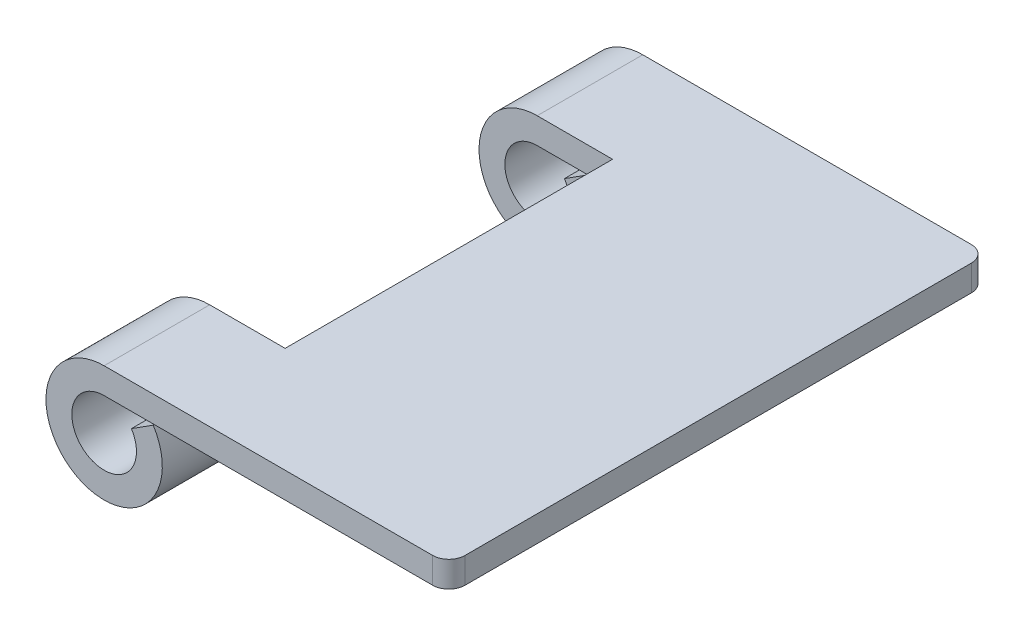
ISO-10303-21;
HEADER;
FILE_DESCRIPTION(('STEP AP214'),'2;1');
FILE_NAME('part.step','',(''),(''),'','','');
FILE_SCHEMA(('AUTOMOTIVE_DESIGN { 1 0 10303 214 1 1 1 1 }'));
ENDSEC;
DATA;
#1=APPLICATION_CONTEXT('core data for automotive mechanical design processes');
#2=APPLICATION_PROTOCOL_DEFINITION('international standard','automotive_design',2000,#1);
#3=PRODUCT_CONTEXT('',#1,'mechanical');
#4=PRODUCT('Part','Part','',(#3));
#5=PRODUCT_RELATED_PRODUCT_CATEGORY('part','',(#4));
#6=PRODUCT_DEFINITION_FORMATION('','',#4);
#7=PRODUCT_DEFINITION_CONTEXT('part definition',#1,'design');
#8=PRODUCT_DEFINITION('design','',#6,#7);
#9=PRODUCT_DEFINITION_SHAPE('','',#8);
#10=(LENGTH_UNIT() NAMED_UNIT(*) SI_UNIT(.MILLI.,.METRE.));
#11=(NAMED_UNIT(*) PLANE_ANGLE_UNIT() SI_UNIT($,.RADIAN.));
#12=(NAMED_UNIT(*) SI_UNIT($,.STERADIAN.) SOLID_ANGLE_UNIT());
#13=UNCERTAINTY_MEASURE_WITH_UNIT(LENGTH_MEASURE(1.E-05),#10,'distance_accuracy_value','');
#14=(GEOMETRIC_REPRESENTATION_CONTEXT(3) GLOBAL_UNCERTAINTY_ASSIGNED_CONTEXT((#13)) GLOBAL_UNIT_ASSIGNED_CONTEXT((#10,
#11,#12)) REPRESENTATION_CONTEXT('',''));
#15=CARTESIAN_POINT('',(0.,0.,0.));
#16=DIRECTION('',(0.,0.,1.));
#17=DIRECTION('',(1.,0.,0.));
#18=AXIS2_PLACEMENT_3D('',#15,#16,#17);
#19=CARTESIAN_POINT('',(-0.00100000000000022,1.5,25.009985));
#20=CARTESIAN_POINT('',(16.009992,1.5,25.009985));
#21=CARTESIAN_POINT('',(-0.00100000000000022,1.5,-0.0100000000000027));
#22=CARTESIAN_POINT('',(16.009992,1.5,-0.0100000000000027));
#23=(BOUNDED_SURFACE() B_SPLINE_SURFACE(1,1,((#19,#20),(#21,#22)),.UNSPECIFIED.,.F.,.F.,
.F.) B_SPLINE_SURFACE_WITH_KNOTS((2,2),(2,2),(1.23874896761322,26.2587339676132),
(0.798199569388909,16.8091915693889),
.UNSPECIFIED.) GEOMETRIC_REPRESENTATION_ITEM() RATIONAL_B_SPLINE_SURFACE(((1.,1.),(1.,1.))) REPRESENTATION_ITEM('') SURFACE());
#24=CARTESIAN_POINT('',(15.999992,1.50000000000006,0.75));
#25=CARTESIAN_POINT('',(15.999992,1.50000000000006,24.249985));
#26=(BOUNDED_CURVE() B_SPLINE_CURVE(1,(#24,#25),.UNSPECIFIED.,.F.,
.F.) B_SPLINE_CURVE_WITH_KNOTS((2,2),(0.,1.),
.UNSPECIFIED.) CURVE() GEOMETRIC_REPRESENTATION_ITEM() RATIONAL_B_SPLINE_CURVE((1.,1.)) REPRESENTATION_ITEM(''));
#27=CARTESIAN_POINT('',(15.999992,1.50000000000006,0.75));
#28=VERTEX_POINT('',#27);
#29=CARTESIAN_POINT('',(15.999992,1.50000000000006,24.249985));
#30=VERTEX_POINT('',#29);
#31=EDGE_CURVE('E10',#28,#30,#26,.T.);
#32=CARTESIAN_POINT('',(15.999992,1.50000000000006,24.249985));
#33=CARTESIAN_POINT('',(15.999992,1.50000000000005,24.999985));
#34=CARTESIAN_POINT('',(15.249992,1.50000000000006,24.999985));
#35=(BOUNDED_CURVE() B_SPLINE_CURVE(2,(#32,#33,#34),.UNSPECIFIED.,.F.,
.F.) B_SPLINE_CURVE_WITH_KNOTS((3,3),(0.,1.),
.UNSPECIFIED.) CURVE() GEOMETRIC_REPRESENTATION_ITEM() RATIONAL_B_SPLINE_CURVE((1.,
0.707106781186548,1.)) REPRESENTATION_ITEM(''));
#36=CARTESIAN_POINT('',(15.249992,1.50000000000006,24.999985));
#37=VERTEX_POINT('',#36);
#38=EDGE_CURVE('E359',#30,#37,#35,.T.);
#39=CARTESIAN_POINT('',(0.,1.5,24.999985));
#40=CARTESIAN_POINT('',(15.249992,1.50000000000006,24.999985));
#41=(BOUNDED_CURVE() B_SPLINE_CURVE(1,(#39,#40),.UNSPECIFIED.,.F.,
.F.) B_SPLINE_CURVE_WITH_KNOTS((2,2),(0.,1.),
.UNSPECIFIED.) CURVE() GEOMETRIC_REPRESENTATION_ITEM() RATIONAL_B_SPLINE_CURVE((1.,1.)) REPRESENTATION_ITEM(''));
#42=CARTESIAN_POINT('',(0.,1.5,24.999985));
#43=VERTEX_POINT('',#42);
#44=EDGE_CURVE('E147',#43,#37,#41,.T.);
#45=CARTESIAN_POINT('',(0.,1.5,20.0999979999999));
#46=CARTESIAN_POINT('',(0.,1.5,24.999985));
#47=(BOUNDED_CURVE() B_SPLINE_CURVE(1,(#45,#46),.UNSPECIFIED.,.F.,
.F.) B_SPLINE_CURVE_WITH_KNOTS((2,2),(0.,1.),
.UNSPECIFIED.) CURVE() GEOMETRIC_REPRESENTATION_ITEM() RATIONAL_B_SPLINE_CURVE((1.,1.)) REPRESENTATION_ITEM(''));
#48=CARTESIAN_POINT('',(0.,1.5,20.0999979999999));
#49=VERTEX_POINT('',#48);
#50=EDGE_CURVE('E208',#49,#43,#47,.T.);
#51=CARTESIAN_POINT('',(0.,1.5,20.0999979999999));
#52=CARTESIAN_POINT('',(3.5,1.49999999999995,20.099998));
#53=(BOUNDED_CURVE() B_SPLINE_CURVE(1,(#51,#52),.UNSPECIFIED.,.F.,
.F.) B_SPLINE_CURVE_WITH_KNOTS((2,2),(0.,1.),
.UNSPECIFIED.) CURVE() GEOMETRIC_REPRESENTATION_ITEM() RATIONAL_B_SPLINE_CURVE((1.,1.)) REPRESENTATION_ITEM(''));
#54=CARTESIAN_POINT('',(3.5,1.49999999999995,20.099998));
#55=VERTEX_POINT('',#54);
#56=EDGE_CURVE('E260',#49,#55,#53,.T.);
#57=CARTESIAN_POINT('',(3.5,1.49999999999995,20.099998));
#58=CARTESIAN_POINT('',(3.5,1.49999999999995,4.899994));
#59=(BOUNDED_CURVE() B_SPLINE_CURVE(1,(#57,#58),.UNSPECIFIED.,.F.,
.F.) B_SPLINE_CURVE_WITH_KNOTS((2,2),(0.,1.),
.UNSPECIFIED.) CURVE() GEOMETRIC_REPRESENTATION_ITEM() RATIONAL_B_SPLINE_CURVE((1.,1.)) REPRESENTATION_ITEM(''));
#60=CARTESIAN_POINT('',(3.5,1.49999999999995,4.899994));
#61=VERTEX_POINT('',#60);
#62=EDGE_CURVE('E156',#55,#61,#59,.T.);
#63=CARTESIAN_POINT('',(3.5,1.49999999999995,4.899994));
#64=CARTESIAN_POINT('',(0.,1.5,4.899994));
#65=(BOUNDED_CURVE() B_SPLINE_CURVE(1,(#63,#64),.UNSPECIFIED.,.F.,
.F.) B_SPLINE_CURVE_WITH_KNOTS((2,2),(0.,1.),
.UNSPECIFIED.) CURVE() GEOMETRIC_REPRESENTATION_ITEM() RATIONAL_B_SPLINE_CURVE((1.,1.)) REPRESENTATION_ITEM(''));
#66=CARTESIAN_POINT('',(0.,1.5,4.899994));
#67=VERTEX_POINT('',#66);
#68=EDGE_CURVE('E277',#61,#67,#65,.T.);
#69=CARTESIAN_POINT('',(0.,1.5,0.));
#70=CARTESIAN_POINT('',(0.,1.5,4.899994));
#71=(BOUNDED_CURVE() B_SPLINE_CURVE(1,(#69,#70),.UNSPECIFIED.,.F.,
.F.) B_SPLINE_CURVE_WITH_KNOTS((2,2),(0.,1.),
.UNSPECIFIED.) CURVE() GEOMETRIC_REPRESENTATION_ITEM() RATIONAL_B_SPLINE_CURVE((1.,1.)) REPRESENTATION_ITEM(''));
#72=CARTESIAN_POINT('',(0.,1.5,0.));
#73=VERTEX_POINT('',#72);
#74=EDGE_CURVE('E227',#73,#67,#71,.T.);
#75=CARTESIAN_POINT('',(0.,1.5,0.));
#76=CARTESIAN_POINT('',(15.249992,1.5,0.));
#77=(BOUNDED_CURVE() B_SPLINE_CURVE(1,(#75,#76),.UNSPECIFIED.,.F.,
.F.) B_SPLINE_CURVE_WITH_KNOTS((2,2),(0.,1.),
.UNSPECIFIED.) CURVE() GEOMETRIC_REPRESENTATION_ITEM() RATIONAL_B_SPLINE_CURVE((1.,1.)) REPRESENTATION_ITEM(''));
#78=CARTESIAN_POINT('',(15.249992,1.5,0.));
#79=VERTEX_POINT('',#78);
#80=EDGE_CURVE('E228',#73,#79,#77,.T.);
#81=CARTESIAN_POINT('',(15.249992,1.5,0.));
#82=CARTESIAN_POINT('',(15.999992,1.50000000000005,0.));
#83=CARTESIAN_POINT('',(15.999992,1.50000000000006,0.75));
#84=(BOUNDED_CURVE() B_SPLINE_CURVE(2,(#81,#82,#83),.UNSPECIFIED.,.F.,
.F.) B_SPLINE_CURVE_WITH_KNOTS((3,3),(0.,1.),
.UNSPECIFIED.) CURVE() GEOMETRIC_REPRESENTATION_ITEM() RATIONAL_B_SPLINE_CURVE((1.,
0.707106781186548,1.)) REPRESENTATION_ITEM(''));
#85=EDGE_CURVE('E351',#79,#28,#84,.T.);
#86=ORIENTED_EDGE('',*,*,#31,.T.);
#87=ORIENTED_EDGE('',*,*,#38,.T.);
#88=ORIENTED_EDGE('',*,*,#44,.F.);
#89=ORIENTED_EDGE('',*,*,#50,.F.);
#90=ORIENTED_EDGE('',*,*,#56,.T.);
#91=ORIENTED_EDGE('',*,*,#62,.T.);
#92=ORIENTED_EDGE('',*,*,#68,.T.);
#93=ORIENTED_EDGE('',*,*,#74,.F.);
#94=ORIENTED_EDGE('',*,*,#80,.T.);
#95=ORIENTED_EDGE('',*,*,#85,.T.);
#96=EDGE_LOOP('',(#86,#87,#88,#89,#90,#91,#92,#93,#94,#95));
#97=FACE_BOUND('',#96,.T.);
#98=ADVANCED_FACE('F15',(#97),#23,.T.);
#99=CARTESIAN_POINT('',(-0.00100000000000022,2.700005,-0.01));
#100=CARTESIAN_POINT('',(16.009992,2.700005,-0.01));
#101=CARTESIAN_POINT('',(-0.00100000000000022,2.700005,25.009985));
#102=CARTESIAN_POINT('',(16.009992,2.700005,25.009985));
#103=(BOUNDED_SURFACE() B_SPLINE_SURFACE(1,1,((#99,#100),(#101,#102)),.UNSPECIFIED.,.F.,.F.,
.F.) B_SPLINE_SURFACE_WITH_KNOTS((2,2),(2,2),(1.23874920229518,26.2587342022951),
(0.798199569388909,16.8091915693889),
.UNSPECIFIED.) GEOMETRIC_REPRESENTATION_ITEM() RATIONAL_B_SPLINE_SURFACE(((1.,1.),(1.,1.))) REPRESENTATION_ITEM('') SURFACE());
#104=CARTESIAN_POINT('',(15.249992,2.700005,24.999985));
#105=CARTESIAN_POINT('',(0.,2.700005,24.999985));
#106=(BOUNDED_CURVE() B_SPLINE_CURVE(1,(#104,#105),.UNSPECIFIED.,.F.,
.F.) B_SPLINE_CURVE_WITH_KNOTS((2,2),(0.,1.),
.UNSPECIFIED.) CURVE() GEOMETRIC_REPRESENTATION_ITEM() RATIONAL_B_SPLINE_CURVE((1.,1.)) REPRESENTATION_ITEM(''));
#107=CARTESIAN_POINT('',(15.249992,2.700005,24.999985));
#108=VERTEX_POINT('',#107);
#109=CARTESIAN_POINT('',(0.,2.700005,24.999985));
#110=VERTEX_POINT('',#109);
#111=EDGE_CURVE('E140',#108,#110,#106,.T.);
#112=CARTESIAN_POINT('',(15.999992,2.700005,24.249985));
#113=CARTESIAN_POINT('',(15.999992,2.700005,24.999985));
#114=CARTESIAN_POINT('',(15.249992,2.700005,24.999985));
#115=(BOUNDED_CURVE() B_SPLINE_CURVE(2,(#112,#113,#114),.UNSPECIFIED.,.F.,
.F.) B_SPLINE_CURVE_WITH_KNOTS((3,3),(0.,1.),
.UNSPECIFIED.) CURVE() GEOMETRIC_REPRESENTATION_ITEM() RATIONAL_B_SPLINE_CURVE((1.,
0.707106781186548,1.)) REPRESENTATION_ITEM(''));
#116=CARTESIAN_POINT('',(15.999992,2.700005,24.249985));
#117=VERTEX_POINT('',#116);
#118=EDGE_CURVE('E209',#117,#108,#115,.T.);
#119=CARTESIAN_POINT('',(15.999992,2.700005,0.75));
#120=CARTESIAN_POINT('',(15.999992,2.700005,24.249985));
#121=(BOUNDED_CURVE() B_SPLINE_CURVE(1,(#119,#120),.UNSPECIFIED.,.F.,
.F.) B_SPLINE_CURVE_WITH_KNOTS((2,2),(0.,1.),
.UNSPECIFIED.) CURVE() GEOMETRIC_REPRESENTATION_ITEM() RATIONAL_B_SPLINE_CURVE((1.,1.)) REPRESENTATION_ITEM(''));
#122=CARTESIAN_POINT('',(15.999992,2.700005,0.75));
#123=VERTEX_POINT('',#122);
#124=EDGE_CURVE('E30',#123,#117,#121,.T.);
#125=CARTESIAN_POINT('',(15.249992,2.700005,0.));
#126=CARTESIAN_POINT('',(15.999992,2.700005,0.));
#127=CARTESIAN_POINT('',(15.999992,2.700005,0.75));
#128=(BOUNDED_CURVE() B_SPLINE_CURVE(2,(#125,#126,#127),.UNSPECIFIED.,.F.,
.F.) B_SPLINE_CURVE_WITH_KNOTS((3,3),(0.,1.),
.UNSPECIFIED.) CURVE() GEOMETRIC_REPRESENTATION_ITEM() RATIONAL_B_SPLINE_CURVE((1.,
0.707106781186548,1.)) REPRESENTATION_ITEM(''));
#129=CARTESIAN_POINT('',(15.249992,2.700005,0.));
#130=VERTEX_POINT('',#129);
#131=EDGE_CURVE('E303',#130,#123,#128,.T.);
#132=CARTESIAN_POINT('',(15.249992,2.700005,0.));
#133=CARTESIAN_POINT('',(0.,2.700005,0.));
#134=(BOUNDED_CURVE() B_SPLINE_CURVE(1,(#132,#133),.UNSPECIFIED.,.F.,
.F.) B_SPLINE_CURVE_WITH_KNOTS((2,2),(0.,1.),
.UNSPECIFIED.) CURVE() GEOMETRIC_REPRESENTATION_ITEM() RATIONAL_B_SPLINE_CURVE((1.,1.)) REPRESENTATION_ITEM(''));
#135=CARTESIAN_POINT('',(0.,2.700005,0.));
#136=VERTEX_POINT('',#135);
#137=EDGE_CURVE('E374',#130,#136,#134,.T.);
#138=CARTESIAN_POINT('',(0.,2.700005,0.));
#139=CARTESIAN_POINT('',(0.,2.700005,4.899994));
#140=(BOUNDED_CURVE() B_SPLINE_CURVE(1,(#138,#139),.UNSPECIFIED.,.F.,
.F.) B_SPLINE_CURVE_WITH_KNOTS((2,2),(0.,1.),
.UNSPECIFIED.) CURVE() GEOMETRIC_REPRESENTATION_ITEM() RATIONAL_B_SPLINE_CURVE((1.,1.)) REPRESENTATION_ITEM(''));
#141=CARTESIAN_POINT('',(0.,2.700005,4.899994));
#142=VERTEX_POINT('',#141);
#143=EDGE_CURVE('E44',#136,#142,#140,.T.);
#144=CARTESIAN_POINT('',(3.5,2.700005,4.899994));
#145=CARTESIAN_POINT('',(0.,2.700005,4.899994));
#146=(BOUNDED_CURVE() B_SPLINE_CURVE(1,(#144,#145),.UNSPECIFIED.,.F.,
.F.) B_SPLINE_CURVE_WITH_KNOTS((2,2),(0.,1.),
.UNSPECIFIED.) CURVE() GEOMETRIC_REPRESENTATION_ITEM() RATIONAL_B_SPLINE_CURVE((1.,1.)) REPRESENTATION_ITEM(''));
#147=CARTESIAN_POINT('',(3.5,2.700005,4.899994));
#148=VERTEX_POINT('',#147);
#149=EDGE_CURVE('E164',#148,#142,#146,.T.);
#150=CARTESIAN_POINT('',(3.5,2.700005,20.099998));
#151=CARTESIAN_POINT('',(3.5,2.700005,4.899994));
#152=(BOUNDED_CURVE() B_SPLINE_CURVE(1,(#150,#151),.UNSPECIFIED.,.F.,
.F.) B_SPLINE_CURVE_WITH_KNOTS((2,2),(0.,1.),
.UNSPECIFIED.) CURVE() GEOMETRIC_REPRESENTATION_ITEM() RATIONAL_B_SPLINE_CURVE((1.,1.)) REPRESENTATION_ITEM(''));
#153=CARTESIAN_POINT('',(3.5,2.700005,20.099998));
#154=VERTEX_POINT('',#153);
#155=EDGE_CURVE('E188',#154,#148,#152,.T.);
#156=CARTESIAN_POINT('',(0.,2.700005,20.099998));
#157=CARTESIAN_POINT('',(3.5,2.700005,20.099998));
#158=(BOUNDED_CURVE() B_SPLINE_CURVE(1,(#156,#157),.UNSPECIFIED.,.F.,
.F.) B_SPLINE_CURVE_WITH_KNOTS((2,2),(0.,1.),
.UNSPECIFIED.) CURVE() GEOMETRIC_REPRESENTATION_ITEM() RATIONAL_B_SPLINE_CURVE((1.,1.)) REPRESENTATION_ITEM(''));
#159=CARTESIAN_POINT('',(0.,2.700005,20.099998));
#160=VERTEX_POINT('',#159);
#161=EDGE_CURVE('E286',#160,#154,#158,.T.);
#162=CARTESIAN_POINT('',(0.,2.700005,20.099998));
#163=CARTESIAN_POINT('',(0.,2.700005,24.999985));
#164=(BOUNDED_CURVE() B_SPLINE_CURVE(1,(#162,#163),.UNSPECIFIED.,.F.,
.F.) B_SPLINE_CURVE_WITH_KNOTS((2,2),(0.,1.),
.UNSPECIFIED.) CURVE() GEOMETRIC_REPRESENTATION_ITEM() RATIONAL_B_SPLINE_CURVE((1.,1.)) REPRESENTATION_ITEM(''));
#165=EDGE_CURVE('E312',#160,#110,#164,.T.);
#166=ORIENTED_EDGE('',*,*,#111,.F.);
#167=ORIENTED_EDGE('',*,*,#118,.F.);
#168=ORIENTED_EDGE('',*,*,#124,.F.);
#169=ORIENTED_EDGE('',*,*,#131,.F.);
#170=ORIENTED_EDGE('',*,*,#137,.T.);
#171=ORIENTED_EDGE('',*,*,#143,.T.);
#172=ORIENTED_EDGE('',*,*,#149,.F.);
#173=ORIENTED_EDGE('',*,*,#155,.F.);
#174=ORIENTED_EDGE('',*,*,#161,.F.);
#175=ORIENTED_EDGE('',*,*,#165,.T.);
#176=EDGE_LOOP('',(#166,#167,#168,#169,#170,#171,#172,#173,#174,#175));
#177=FACE_BOUND('',#176,.T.);
#178=ADVANCED_FACE('F532',(#177),#103,.T.);
#179=CARTESIAN_POINT('',(15.999992,1.49855999400005,24.250985));
#180=CARTESIAN_POINT('',(15.999992,2.701445006,24.250985));
#181=CARTESIAN_POINT('',(15.999992,1.49855999400005,0.749));
#182=CARTESIAN_POINT('',(15.999992,2.701445006,0.749));
#183=(BOUNDED_SURFACE() B_SPLINE_SURFACE(1,1,((#179,#180),(#181,#182)),.UNSPECIFIED.,.F.,.F.,
.F.) B_SPLINE_SURFACE_WITH_KNOTS((2,2),(2,2),(1.17282398460143,24.6748089846014),
(0.0823333333333327,0.917666666666666),
.UNSPECIFIED.) GEOMETRIC_REPRESENTATION_ITEM() RATIONAL_B_SPLINE_SURFACE(((1.,1.),(1.,1.))) REPRESENTATION_ITEM('') SURFACE());
#184=CARTESIAN_POINT('',(15.999992,2.700005,24.249985));
#185=CARTESIAN_POINT('',(15.999992,1.50000000000006,24.249985));
#186=(BOUNDED_CURVE() B_SPLINE_CURVE(1,(#184,#185),.UNSPECIFIED.,.F.,
.F.) B_SPLINE_CURVE_WITH_KNOTS((2,2),(0.,1.),
.UNSPECIFIED.) CURVE() GEOMETRIC_REPRESENTATION_ITEM() RATIONAL_B_SPLINE_CURVE((1.,1.)) REPRESENTATION_ITEM(''));
#187=EDGE_CURVE('E219',#117,#30,#186,.T.);
#188=CARTESIAN_POINT('',(15.999992,2.700005,0.75));
#189=CARTESIAN_POINT('',(15.999992,1.50000000000006,0.75));
#190=(BOUNDED_CURVE() B_SPLINE_CURVE(1,(#188,#189),.UNSPECIFIED.,.F.,
.F.) B_SPLINE_CURVE_WITH_KNOTS((2,2),(0.,1.),
.UNSPECIFIED.) CURVE() GEOMETRIC_REPRESENTATION_ITEM() RATIONAL_B_SPLINE_CURVE((1.,1.)) REPRESENTATION_ITEM(''));
#191=EDGE_CURVE('E189',#123,#28,#190,.T.);
#192=ORIENTED_EDGE('',*,*,#124,.T.);
#193=ORIENTED_EDGE('',*,*,#187,.T.);
#194=ORIENTED_EDGE('',*,*,#31,.F.);
#195=ORIENTED_EDGE('',*,*,#191,.F.);
#196=EDGE_LOOP('',(#192,#193,#194,#195));
#197=FACE_BOUND('',#196,.T.);
#198=ADVANCED_FACE('F533',(#197),#183,.T.);
#199=CARTESIAN_POINT('',(1.26089432165286,0.812493390510708,20.0899968269145));
#200=CARTESIAN_POINT('',(2.25174650146299,-0.725192825416108,20.0899968269145));
#201=CARTESIAN_POINT('',(0.549751840086445,-1.39562635197304,20.0899968269145));
#202=CARTESIAN_POINT('',(-1.20479094925537,-2.08675913660944,20.0899968269145));
#203=CARTESIAN_POINT('',(-1.48352379504287,-0.221714116694415,20.0899968269145));
#204=CARTESIAN_POINT('',(-1.74229752239125,1.50978132336535,20.0899968269144));
#205=CARTESIAN_POINT('',(0.00840067143963752,1.49997647605533,20.0899968269145));
#206=CARTESIAN_POINT('',(1.26089432165286,0.812493390510708,25.0099861730855));
#207=CARTESIAN_POINT('',(2.25174650146299,-0.725192825416108,25.0099861730855));
#208=CARTESIAN_POINT('',(0.549751840086445,-1.39562635197304,25.0099861730855));
#209=CARTESIAN_POINT('',(-1.20479094925537,-2.08675913660944,25.0099861730855));
#210=CARTESIAN_POINT('',(-1.48352379504287,-0.221714116694415,25.0099861730855));
#211=CARTESIAN_POINT('',(-1.74229752239125,1.50978132336535,25.0099861730855));
#212=CARTESIAN_POINT('',(0.00840067143963752,1.49997647605533,25.0099861730855));
#213=(BOUNDED_SURFACE() B_SPLINE_SURFACE(1,2,((#199,#200,#201,#202,#203,#204,#205),(#206,#207,
#208,#209,#210,#211,#212)),.UNSPECIFIED.,.F.,.F.,.F.) B_SPLINE_SURFACE_WITH_KNOTS((2,2),(3,2,2,
3),(0.112498501914524,5.03248784808554),(0.0545742495245047,2.89405644490542,5.78811288981085,
8.54957941023183),
.UNSPECIFIED.) GEOMETRIC_REPRESENTATION_ITEM() RATIONAL_B_SPLINE_SURFACE(((0.98603171652139,
0.629633012109616,1.,0.62251463663762,1.,0.639808962707281,0.966996011761496),(0.98603171652139,
0.629633012109616,1.,0.62251463663762,1.,0.639808962707281,0.966996011761496))) REPRESENTATION_ITEM('') SURFACE());
#214=CARTESIAN_POINT('',(1.26533799710337,0.805555555555555,20.0999979999999));
#215=CARTESIAN_POINT('',(1.26533799710337,0.805555555555555,24.999985));
#216=(BOUNDED_CURVE() B_SPLINE_CURVE(1,(#214,#215),.UNSPECIFIED.,.F.,
.F.) B_SPLINE_CURVE_WITH_KNOTS((2,2),(0.,1.),
.UNSPECIFIED.) CURVE() GEOMETRIC_REPRESENTATION_ITEM() RATIONAL_B_SPLINE_CURVE((1.,1.)) REPRESENTATION_ITEM(''));
#217=CARTESIAN_POINT('',(1.26533799710337,0.805555555555555,20.0999979999999));
#218=VERTEX_POINT('',#217);
#219=CARTESIAN_POINT('',(1.26533799710337,0.805555555555555,24.999985));
#220=VERTEX_POINT('',#219);
#221=EDGE_CURVE('E124',#218,#220,#216,.T.);
#222=CARTESIAN_POINT('',(1.26533799710337,0.805555555555556,20.0999979999999));
#223=CARTESIAN_POINT('',(1.89042224964768,-0.176304541715818,20.099998));
#224=CARTESIAN_POINT('',(1.09455667889989,-1.02564403019549,20.0999979999999));
#225=CARTESIAN_POINT('',(0.298691108152092,-1.87498351867516,20.099998));
#226=CARTESIAN_POINT('',(-0.721687836487032,-1.31497781983829,20.0999979999999));
#227=CARTESIAN_POINT('',(-1.74206678112616,-0.754972121001419,20.099998));
#228=CARTESIAN_POINT('',(-1.45300838431123,0.37251393949929,20.0999979999999));
#229=CARTESIAN_POINT('',(-1.1639499874963,1.5,20.099998));
#230=CARTESIAN_POINT('',(0.,1.5,20.0999979999999));
#231=(BOUNDED_CURVE() B_SPLINE_CURVE(2,(#222,#223,#224,#225,#226,#227,#228,#229,#230),
.UNSPECIFIED.,.F.,.F.) B_SPLINE_CURVE_WITH_KNOTS((3,2,2,2,3),(0.,0.25,0.5,0.75,1.),
.UNSPECIFIED.) CURVE() GEOMETRIC_REPRESENTATION_ITEM() RATIONAL_B_SPLINE_CURVE((1.,
0.790045133626194,1.,0.790045133626194,1.,0.790045133626194,1.,0.790045133626194,1.)) REPRESENTATION_ITEM(''));
#232=EDGE_CURVE('E21',#218,#49,#231,.T.);
#233=CARTESIAN_POINT('',(1.26533799710337,0.805555555555556,24.999985));
#234=CARTESIAN_POINT('',(1.89042224964768,-0.176304541715817,24.999985));
#235=CARTESIAN_POINT('',(1.09455667889989,-1.02564403019549,24.999985));
#236=CARTESIAN_POINT('',(0.298691108152093,-1.87498351867516,24.999985));
#237=CARTESIAN_POINT('',(-0.721687836487032,-1.31497781983829,24.999985));
#238=CARTESIAN_POINT('',(-1.74206678112616,-0.754972121001419,24.999985));
#239=CARTESIAN_POINT('',(-1.45300838431123,0.37251393949929,24.999985));
#240=CARTESIAN_POINT('',(-1.1639499874963,1.5,24.999985));
#241=CARTESIAN_POINT('',(0.,1.5,24.999985));
#242=(BOUNDED_CURVE() B_SPLINE_CURVE(2,(#233,#234,#235,#236,#237,#238,#239,#240,#241),
.UNSPECIFIED.,.F.,.F.) B_SPLINE_CURVE_WITH_KNOTS((3,2,2,2,3),(0.,0.25,0.5,0.75,1.),
.UNSPECIFIED.) CURVE() GEOMETRIC_REPRESENTATION_ITEM() RATIONAL_B_SPLINE_CURVE((1.,
0.790045133626194,1.,0.790045133626194,1.,0.790045133626194,1.,0.790045133626194,1.)) REPRESENTATION_ITEM(''));
#243=EDGE_CURVE('E135',#220,#43,#242,.T.);
#244=ORIENTED_EDGE('',*,*,#221,.F.);
#245=ORIENTED_EDGE('',*,*,#232,.T.);
#246=ORIENTED_EDGE('',*,*,#50,.T.);
#247=ORIENTED_EDGE('',*,*,#243,.F.);
#248=EDGE_LOOP('',(#244,#245,#246,#247));
#249=FACE_BOUND('',#248,.T.);
#250=ADVANCED_FACE('F535',(#249),#213,.F.);
#251=CARTESIAN_POINT('',(1.26089432165285,0.812493390510707,-0.010001173085475));
#252=CARTESIAN_POINT('',(2.25174650146299,-0.725192825416108,-0.010001173085475));
#253=CARTESIAN_POINT('',(0.549751840086445,-1.39562635197304,-0.010001173085475));
#254=CARTESIAN_POINT('',(-1.20479094925537,-2.08675913660944,-0.010001173085475));
#255=CARTESIAN_POINT('',(-1.48352379504287,-0.221714116694415,-0.010001173085475));
#256=CARTESIAN_POINT('',(-1.74229752239125,1.50978132336535,-0.010001173085475));
#257=CARTESIAN_POINT('',(0.00840067143963749,1.49997647605533,-0.010001173085475));
#258=CARTESIAN_POINT('',(1.26089432165285,0.812493390510707,4.90999517308547));
#259=CARTESIAN_POINT('',(2.25174650146299,-0.725192825416108,4.90999517308548));
#260=CARTESIAN_POINT('',(0.549751840086445,-1.39562635197304,4.90999517308548));
#261=CARTESIAN_POINT('',(-1.20479094925537,-2.08675913660944,4.90999517308548));
#262=CARTESIAN_POINT('',(-1.48352379504287,-0.221714116694415,4.90999517308548));
#263=CARTESIAN_POINT('',(-1.74229752239125,1.50978132336535,4.90999517308548));
#264=CARTESIAN_POINT('',(0.00840067143963752,1.49997647605533,4.90999517308548));
#265=(BOUNDED_SURFACE() B_SPLINE_SURFACE(1,2,((#251,#252,#253,#254,#255,#256,#257),(#258,#259,
#260,#261,#262,#263,#264)),.UNSPECIFIED.,.F.,.F.,.F.) B_SPLINE_SURFACE_WITH_KNOTS((2,2),(3,2,2,
3),(0.112498676914525,5.03249502308548),(0.0545742495245048,2.89405644490542,5.78811288981085,
8.54957941023183),
.UNSPECIFIED.) GEOMETRIC_REPRESENTATION_ITEM() RATIONAL_B_SPLINE_SURFACE(((0.98603171652139,
0.629633012109616,1.,0.62251463663762,1.,0.639808962707281,0.966996011761496),(0.98603171652139,
0.629633012109616,1.,0.62251463663762,1.,0.639808962707281,0.966996011761496))) REPRESENTATION_ITEM('') SURFACE());
#266=CARTESIAN_POINT('',(0.,1.5,4.899994));
#267=CARTESIAN_POINT('',(-1.1639499874963,1.5,4.899994));
#268=CARTESIAN_POINT('',(-1.45300838431123,0.372513939499291,4.899994));
#269=CARTESIAN_POINT('',(-1.74206678112616,-0.754972121001419,4.899994));
#270=CARTESIAN_POINT('',(-0.721687836487032,-1.31497781983829,4.899994));
#271=CARTESIAN_POINT('',(0.298691108152091,-1.87498351867516,4.899994));
#272=CARTESIAN_POINT('',(1.09455667889989,-1.02564403019549,4.899994));
#273=CARTESIAN_POINT('',(1.89042224964768,-0.176304541715818,4.899994));
#274=CARTESIAN_POINT('',(1.26533799710337,0.805555555555556,4.899994));
#275=(BOUNDED_CURVE() B_SPLINE_CURVE(2,(#266,#267,#268,#269,#270,#271,#272,#273,#274),
.UNSPECIFIED.,.F.,.F.) B_SPLINE_CURVE_WITH_KNOTS((3,2,2,2,3),(0.,0.25,0.5,0.75,1.),
.UNSPECIFIED.) CURVE() GEOMETRIC_REPRESENTATION_ITEM() RATIONAL_B_SPLINE_CURVE((1.,
0.790045133626194,1.,0.790045133626194,1.,0.790045133626194,1.,0.790045133626194,1.)) REPRESENTATION_ITEM(''));
#276=CARTESIAN_POINT('',(1.26533799710337,0.805555555555555,4.899994));
#277=VERTEX_POINT('',#276);
#278=EDGE_CURVE('E199',#67,#277,#275,.T.);
#279=CARTESIAN_POINT('',(1.26533799710337,0.805555555555555,0.));
#280=CARTESIAN_POINT('',(1.26533799710337,0.805555555555555,4.899994));
#281=(BOUNDED_CURVE() B_SPLINE_CURVE(1,(#279,#280),.UNSPECIFIED.,.F.,
.F.) B_SPLINE_CURVE_WITH_KNOTS((2,2),(0.,1.),
.UNSPECIFIED.) CURVE() GEOMETRIC_REPRESENTATION_ITEM() RATIONAL_B_SPLINE_CURVE((1.,1.)) REPRESENTATION_ITEM(''));
#282=CARTESIAN_POINT('',(1.26533799710337,0.805555555555555,0.));
#283=VERTEX_POINT('',#282);
#284=EDGE_CURVE('E381',#283,#277,#281,.T.);
#285=CARTESIAN_POINT('',(1.26533799710337,0.805555555555556,0.));
#286=CARTESIAN_POINT('',(1.89042224964768,-0.176304541715817,0.));
#287=CARTESIAN_POINT('',(1.09455667889989,-1.02564403019549,0.));
#288=CARTESIAN_POINT('',(0.298691108152093,-1.87498351867516,0.));
#289=CARTESIAN_POINT('',(-0.721687836487032,-1.31497781983829,0.));
#290=CARTESIAN_POINT('',(-1.74206678112616,-0.754972121001419,0.));
#291=CARTESIAN_POINT('',(-1.45300838431123,0.37251393949929,0.));
#292=CARTESIAN_POINT('',(-1.1639499874963,1.5,0.));
#293=CARTESIAN_POINT('',(0.,1.5,0.));
#294=(BOUNDED_CURVE() B_SPLINE_CURVE(2,(#285,#286,#287,#288,#289,#290,#291,#292,#293),
.UNSPECIFIED.,.F.,.F.) B_SPLINE_CURVE_WITH_KNOTS((3,2,2,2,3),(0.,0.25,0.5,0.75,1.),
.UNSPECIFIED.) CURVE() GEOMETRIC_REPRESENTATION_ITEM() RATIONAL_B_SPLINE_CURVE((1.,
0.790045133626194,1.,0.790045133626194,1.,0.790045133626194,1.,0.790045133626194,1.)) REPRESENTATION_ITEM(''));
#295=EDGE_CURVE('E236',#283,#73,#294,.T.);
#296=ORIENTED_EDGE('',*,*,#74,.T.);
#297=ORIENTED_EDGE('',*,*,#278,.T.);
#298=ORIENTED_EDGE('',*,*,#284,.F.);
#299=ORIENTED_EDGE('',*,*,#295,.T.);
#300=EDGE_LOOP('',(#296,#297,#298,#299));
#301=FACE_BOUND('',#300,.T.);
#302=ADVANCED_FACE('F542',(#301),#265,.F.);
#303=CARTESIAN_POINT('',(2.27317067725503,1.45694717545555,20.0899968269627));
#304=CARTESIAN_POINT('',(4.0455339110233,-1.30834466238146,20.0899968269627));
#305=CARTESIAN_POINT('',(0.989553312155601,-2.51212743355146,20.0899968269627));
#306=CARTESIAN_POINT('',(-2.16862370865967,-3.75616644589699,20.0899968269627));
#307=CARTESIAN_POINT('',(-2.67034283107717,-0.399085410049946,20.0899968269627));
#308=CARTESIAN_POINT('',(-3.13496475396941,2.70977246776946,20.0899968269627));
#309=CARTESIAN_POINT('',(0.00840526540571814,2.69998691691524,20.0899968269627));
#310=CARTESIAN_POINT('',(2.27317067725503,1.45694717545555,25.0099861730372));
#311=CARTESIAN_POINT('',(4.0455339110233,-1.30834466238146,25.0099861730372));
#312=CARTESIAN_POINT('',(0.989553312155601,-2.51212743355146,25.0099861730372));
#313=CARTESIAN_POINT('',(-2.16862370865967,-3.75616644589699,25.0099861730373));
#314=CARTESIAN_POINT('',(-2.67034283107717,-0.399085410049946,25.0099861730372));
#315=CARTESIAN_POINT('',(-3.13496475396941,2.70977246776946,25.0099861730372));
#316=CARTESIAN_POINT('',(0.00840526540571814,2.69998691691524,25.0099861730372));
#317=(BOUNDED_SURFACE() B_SPLINE_SURFACE(1,2,((#303,#304,#305,#306,#307,#308,#309),(#310,#311,
#312,#313,#314,#315,#316)),.UNSPECIFIED.,.F.,.F.,.F.) B_SPLINE_SURFACE_WITH_KNOTS((2,2),(3,2,2,
3),(0.112498501962779,5.03248784803731),(0.106234587660744,5.20930160082976,10.4186032016595,
15.3812419999006),
.UNSPECIFIED.) GEOMETRIC_REPRESENTATION_ITEM() RATIONAL_B_SPLINE_SURFACE(((0.984917674267593,
0.630212789863838,1.,0.62251463663762,1.,0.640388740461503,0.965944486260476),
(0.984917674267593,0.630212789863838,1.,0.62251463663762,1.,0.640388740461503,0.965944486260476))) REPRESENTATION_ITEM('') SURFACE());
#318=CARTESIAN_POINT('',(2.27760839478608,1.45,20.0999979999999));
#319=CARTESIAN_POINT('',(3.40276004936583,-0.317351709784824,20.0999979999999));
#320=CARTESIAN_POINT('',(1.97020202201979,-1.84616178772057,20.0999979999999));
#321=CARTESIAN_POINT('',(0.537643994673766,-3.37497186565633,20.099998));
#322=CARTESIAN_POINT('',(-1.29903810567666,-2.36695757570893,20.0999979999999));
#323=CARTESIAN_POINT('',(-3.13572020602708,-1.35894328576152,20.099998));
#324=CARTESIAN_POINT('',(-2.61541509176021,0.670532624467413,20.099998));
#325=CARTESIAN_POINT('',(-2.09510997749334,2.70000853469635,20.099998));
#326=CARTESIAN_POINT('',(0.,2.700005,20.099998));
#327=(BOUNDED_CURVE() B_SPLINE_CURVE(2,(#318,#319,#320,#321,#322,#323,#324,#325,#326),
.UNSPECIFIED.,.F.,.F.) B_SPLINE_CURVE_WITH_KNOTS((3,2,2,2,3),(0.,0.25,0.5,0.75,1.),
.UNSPECIFIED.) CURVE() GEOMETRIC_REPRESENTATION_ITEM() RATIONAL_B_SPLINE_CURVE((1.,
0.790045133626194,1.,0.790045133626194,1.,0.790045133626194,1.,0.790045133626194,1.)) REPRESENTATION_ITEM(''));
#328=CARTESIAN_POINT('',(2.27760839478608,1.45,20.0999979999999));
#329=VERTEX_POINT('',#328);
#330=EDGE_CURVE('E119',#329,#160,#327,.T.);
#331=CARTESIAN_POINT('',(2.27760839478608,1.45,20.0999979999999));
#332=CARTESIAN_POINT('',(2.27760839478608,1.45,24.999985));
#333=(BOUNDED_CURVE() B_SPLINE_CURVE(1,(#331,#332),.UNSPECIFIED.,.F.,
.F.) B_SPLINE_CURVE_WITH_KNOTS((2,2),(0.,1.),
.UNSPECIFIED.) CURVE() GEOMETRIC_REPRESENTATION_ITEM() RATIONAL_B_SPLINE_CURVE((1.,1.)) REPRESENTATION_ITEM(''));
#334=CARTESIAN_POINT('',(2.27760839478608,1.45,24.999985));
#335=VERTEX_POINT('',#334);
#336=EDGE_CURVE('E112',#329,#335,#333,.T.);
#337=CARTESIAN_POINT('',(2.27760839478608,1.45,24.999985));
#338=CARTESIAN_POINT('',(3.40276004936583,-0.317351709784823,24.999985));
#339=CARTESIAN_POINT('',(1.97020202201979,-1.84616178772057,24.999985));
#340=CARTESIAN_POINT('',(0.537643994673765,-3.37497186565633,24.999985));
#341=CARTESIAN_POINT('',(-1.29903810567666,-2.36695757570893,24.999985));
#342=CARTESIAN_POINT('',(-3.13572020602708,-1.35894328576152,24.999985));
#343=CARTESIAN_POINT('',(-2.6154150917602,0.670532624467412,24.999985));
#344=CARTESIAN_POINT('',(-2.09510997749334,2.70000853469635,24.999985));
#345=CARTESIAN_POINT('',(0.,2.700005,24.999985));
#346=(BOUNDED_CURVE() B_SPLINE_CURVE(2,(#337,#338,#339,#340,#341,#342,#343,#344,#345),
.UNSPECIFIED.,.F.,.F.) B_SPLINE_CURVE_WITH_KNOTS((3,2,2,2,3),(0.,0.25,0.5,0.75,1.),
.UNSPECIFIED.) CURVE() GEOMETRIC_REPRESENTATION_ITEM() RATIONAL_B_SPLINE_CURVE((1.,
0.790045133626194,1.,0.790045133626194,1.,0.790045133626194,1.,0.790045133626194,1.)) REPRESENTATION_ITEM(''));
#347=EDGE_CURVE('E116',#335,#110,#346,.T.);
#348=ORIENTED_EDGE('',*,*,#330,.F.);
#349=ORIENTED_EDGE('',*,*,#336,.T.);
#350=ORIENTED_EDGE('',*,*,#347,.T.);
#351=ORIENTED_EDGE('',*,*,#165,.F.);
#352=EDGE_LOOP('',(#348,#349,#350,#351));
#353=FACE_BOUND('',#352,.T.);
#354=ADVANCED_FACE('F114',(#353),#317,.T.);
#355=CARTESIAN_POINT('',(2.27317067725503,1.45694717545555,-0.0100011730372196));
#356=CARTESIAN_POINT('',(4.0455339110233,-1.30834466238146,-0.0100011730372196));
#357=CARTESIAN_POINT('',(0.989553312155601,-2.51212743355146,-0.0100011730372196));
#358=CARTESIAN_POINT('',(-2.16862370865967,-3.75616644589699,-0.0100011730372196));
#359=CARTESIAN_POINT('',(-2.67034283107717,-0.399085410049946,-0.0100011730372196));
#360=CARTESIAN_POINT('',(-3.13496475396941,2.70977246776946,-0.0100011730372196));
#361=CARTESIAN_POINT('',(0.00840526540571814,2.69998691691524,-0.0100011730372196));
#362=CARTESIAN_POINT('',(2.27317067725503,1.45694717545555,4.90999517303722));
#363=CARTESIAN_POINT('',(4.0455339110233,-1.30834466238146,4.90999517303722));
#364=CARTESIAN_POINT('',(0.989553312155601,-2.51212743355146,4.90999517303722));
#365=CARTESIAN_POINT('',(-2.16862370865967,-3.75616644589699,4.90999517303722));
#366=CARTESIAN_POINT('',(-2.67034283107717,-0.399085410049946,4.90999517303722));
#367=CARTESIAN_POINT('',(-3.13496475396941,2.70977246776946,4.90999517303722));
#368=CARTESIAN_POINT('',(0.00840526540571814,2.69998691691524,4.90999517303723));
#369=(BOUNDED_SURFACE() B_SPLINE_SURFACE(1,2,((#355,#356,#357,#358,#359,#360,#361),(#362,#363,
#364,#365,#366,#367,#368)),.UNSPECIFIED.,.F.,.F.,.F.) B_SPLINE_SURFACE_WITH_KNOTS((2,2),(3,2,2,
3),(0.11249867696278,5.03249502303722),(0.106234587660744,5.20930160082976,10.4186032016595,
15.3812419999006),
.UNSPECIFIED.) GEOMETRIC_REPRESENTATION_ITEM() RATIONAL_B_SPLINE_SURFACE(((0.984917674267593,
0.630212789863838,1.,0.62251463663762,1.,0.640388740461503,0.965944486260476),
(0.984917674267593,0.630212789863838,1.,0.62251463663762,1.,0.640388740461503,0.965944486260476))) REPRESENTATION_ITEM('') SURFACE());
#370=CARTESIAN_POINT('',(0.,2.700005,4.899994));
#371=CARTESIAN_POINT('',(-2.09510997749333,2.70000853469635,4.899994));
#372=CARTESIAN_POINT('',(-2.6154150917602,0.670532624467413,4.899994));
#373=CARTESIAN_POINT('',(-3.13572020602708,-1.35894328576152,4.899994));
#374=CARTESIAN_POINT('',(-1.29903810567666,-2.36695757570893,4.899994));
#375=CARTESIAN_POINT('',(0.537643994673763,-3.37497186565633,4.899994));
#376=CARTESIAN_POINT('',(1.97020202201979,-1.84616178772057,4.899994));
#377=CARTESIAN_POINT('',(3.40276004936583,-0.317351709784823,4.899994));
#378=CARTESIAN_POINT('',(2.27760839478608,1.45,4.899994));
#379=(BOUNDED_CURVE() B_SPLINE_CURVE(2,(#370,#371,#372,#373,#374,#375,#376,#377,#378),
.UNSPECIFIED.,.F.,.F.) B_SPLINE_CURVE_WITH_KNOTS((3,2,2,2,3),(0.,0.25,0.5,0.75,1.),
.UNSPECIFIED.) CURVE() GEOMETRIC_REPRESENTATION_ITEM() RATIONAL_B_SPLINE_CURVE((1.,
0.790045133626194,1.,0.790045133626194,1.,0.790045133626194,1.,0.790045133626194,1.)) REPRESENTATION_ITEM(''));
#380=CARTESIAN_POINT('',(2.27760839478608,1.45,4.899994));
#381=VERTEX_POINT('',#380);
#382=EDGE_CURVE('E200',#142,#381,#379,.T.);
#383=CARTESIAN_POINT('',(2.27760839478608,1.45,0.));
#384=CARTESIAN_POINT('',(3.40276004936583,-0.317351709784823,0.));
#385=CARTESIAN_POINT('',(1.97020202201979,-1.84616178772057,0.));
#386=CARTESIAN_POINT('',(0.537643994673765,-3.37497186565633,0.));
#387=CARTESIAN_POINT('',(-1.29903810567666,-2.36695757570893,0.));
#388=CARTESIAN_POINT('',(-3.13572020602708,-1.35894328576152,0.));
#389=CARTESIAN_POINT('',(-2.6154150917602,0.670532624467412,0.));
#390=CARTESIAN_POINT('',(-2.09510997749334,2.70000853469635,0.));
#391=CARTESIAN_POINT('',(0.,2.700005,0.));
#392=(BOUNDED_CURVE() B_SPLINE_CURVE(2,(#383,#384,#385,#386,#387,#388,#389,#390,#391),
.UNSPECIFIED.,.F.,.F.) B_SPLINE_CURVE_WITH_KNOTS((3,2,2,2,3),(0.,0.25,0.5,0.75,1.),
.UNSPECIFIED.) CURVE() GEOMETRIC_REPRESENTATION_ITEM() RATIONAL_B_SPLINE_CURVE((1.,
0.790045133626194,1.,0.790045133626194,1.,0.790045133626194,1.,0.790045133626194,1.)) REPRESENTATION_ITEM(''));
#393=CARTESIAN_POINT('',(2.27760839478608,1.45,0.));
#394=VERTEX_POINT('',#393);
#395=EDGE_CURVE('E270',#394,#136,#392,.T.);
#396=CARTESIAN_POINT('',(2.27760839478608,1.45,0.));
#397=CARTESIAN_POINT('',(2.27760839478608,1.45,4.899994));
#398=(BOUNDED_CURVE() B_SPLINE_CURVE(1,(#396,#397),.UNSPECIFIED.,.F.,
.F.) B_SPLINE_CURVE_WITH_KNOTS((2,2),(0.,1.),
.UNSPECIFIED.) CURVE() GEOMETRIC_REPRESENTATION_ITEM() RATIONAL_B_SPLINE_CURVE((1.,1.)) REPRESENTATION_ITEM(''));
#399=EDGE_CURVE('E125',#394,#381,#398,.T.);
#400=ORIENTED_EDGE('',*,*,#382,.F.);
#401=ORIENTED_EDGE('',*,*,#143,.F.);
#402=ORIENTED_EDGE('',*,*,#395,.F.);
#403=ORIENTED_EDGE('',*,*,#399,.T.);
#404=EDGE_LOOP('',(#400,#401,#402,#403));
#405=FACE_BOUND('',#404,.T.);
#406=ADVANCED_FACE('F569',(#405),#369,.T.);
#407=CARTESIAN_POINT('',(2.2788231192633,1.45077333333333,20.0989979999999));
#408=CARTESIAN_POINT('',(2.2788231192633,1.45077333333333,25.000985));
#409=CARTESIAN_POINT('',(1.26412327262615,0.804782222222222,20.0989979999999));
#410=CARTESIAN_POINT('',(1.26412327262615,0.804782222222222,25.000985));
#411=(BOUNDED_SURFACE() B_SPLINE_SURFACE(1,1,((#407,#408),(#409,#410)),.UNSPECIFIED.,.F.,.F.,
.F.) B_SPLINE_SURFACE_WITH_KNOTS((2,2),(2,2),(0.0823333333333336,0.917666666666666),
(0.243753863670962,5.14574086367101),
.UNSPECIFIED.) GEOMETRIC_REPRESENTATION_ITEM() RATIONAL_B_SPLINE_SURFACE(((1.,1.),(1.,1.))) REPRESENTATION_ITEM('') SURFACE());
#412=CARTESIAN_POINT('',(2.27760839478608,1.45,20.0999979999999));
#413=CARTESIAN_POINT('',(1.26533799710337,0.805555555555555,20.0999979999999));
#414=(BOUNDED_CURVE() B_SPLINE_CURVE(1,(#412,#413),.UNSPECIFIED.,.F.,
.F.) B_SPLINE_CURVE_WITH_KNOTS((2,2),(0.,1.),
.UNSPECIFIED.) CURVE() GEOMETRIC_REPRESENTATION_ITEM() RATIONAL_B_SPLINE_CURVE((1.,1.)) REPRESENTATION_ITEM(''));
#415=EDGE_CURVE('E166',#329,#218,#414,.T.);
#416=CARTESIAN_POINT('',(2.27760839478608,1.45,24.999985));
#417=CARTESIAN_POINT('',(1.26533799710337,0.805555555555555,24.999985));
#418=(BOUNDED_CURVE() B_SPLINE_CURVE(1,(#416,#417),.UNSPECIFIED.,.F.,
.F.) B_SPLINE_CURVE_WITH_KNOTS((2,2),(0.,1.),
.UNSPECIFIED.) CURVE() GEOMETRIC_REPRESENTATION_ITEM() RATIONAL_B_SPLINE_CURVE((1.,1.)) REPRESENTATION_ITEM(''));
#419=EDGE_CURVE('E128',#335,#220,#418,.T.);
#420=ORIENTED_EDGE('',*,*,#336,.F.);
#421=ORIENTED_EDGE('',*,*,#415,.T.);
#422=ORIENTED_EDGE('',*,*,#221,.T.);
#423=ORIENTED_EDGE('',*,*,#419,.F.);
#424=EDGE_LOOP('',(#420,#421,#422,#423));
#425=FACE_BOUND('',#424,.T.);
#426=ADVANCED_FACE('F129',(#425),#411,.T.);
#427=CARTESIAN_POINT('',(2.2788231192633,1.45077333333333,-0.001));
#428=CARTESIAN_POINT('',(2.2788231192633,1.45077333333333,4.900994));
#429=CARTESIAN_POINT('',(1.26412327262615,0.804782222222222,-0.001));
#430=CARTESIAN_POINT('',(1.26412327262615,0.804782222222222,4.900994));
#431=(BOUNDED_SURFACE() B_SPLINE_SURFACE(1,1,((#427,#428),(#429,#430)),.UNSPECIFIED.,.F.,.F.,
.F.) B_SPLINE_SURFACE_WITH_KNOTS((2,2),(2,2),(0.0823333333333337,0.917666666666666),
(0.24375467329664,5.14574867329664),
.UNSPECIFIED.) GEOMETRIC_REPRESENTATION_ITEM() RATIONAL_B_SPLINE_SURFACE(((1.,1.),(1.,1.))) REPRESENTATION_ITEM('') SURFACE());
#432=CARTESIAN_POINT('',(1.26533799710337,0.805555555555555,4.899994));
#433=CARTESIAN_POINT('',(2.27760839478608,1.45,4.899994));
#434=(BOUNDED_CURVE() B_SPLINE_CURVE(1,(#432,#433),.UNSPECIFIED.,.F.,
.F.) B_SPLINE_CURVE_WITH_KNOTS((2,2),(0.,1.),
.UNSPECIFIED.) CURVE() GEOMETRIC_REPRESENTATION_ITEM() RATIONAL_B_SPLINE_CURVE((1.,1.)) REPRESENTATION_ITEM(''));
#435=EDGE_CURVE('E190',#277,#381,#434,.T.);
#436=CARTESIAN_POINT('',(2.27760839478608,1.45,0.));
#437=CARTESIAN_POINT('',(1.26533799710337,0.805555555555555,0.));
#438=(BOUNDED_CURVE() B_SPLINE_CURVE(1,(#436,#437),.UNSPECIFIED.,.F.,
.F.) B_SPLINE_CURVE_WITH_KNOTS((2,2),(0.,1.),
.UNSPECIFIED.) CURVE() GEOMETRIC_REPRESENTATION_ITEM() RATIONAL_B_SPLINE_CURVE((1.,1.)) REPRESENTATION_ITEM(''));
#439=EDGE_CURVE('E248',#394,#283,#438,.T.);
#440=ORIENTED_EDGE('',*,*,#284,.T.);
#441=ORIENTED_EDGE('',*,*,#435,.T.);
#442=ORIENTED_EDGE('',*,*,#399,.F.);
#443=ORIENTED_EDGE('',*,*,#439,.T.);
#444=EDGE_LOOP('',(#440,#441,#442,#443));
#445=FACE_BOUND('',#444,.T.);
#446=ADVANCED_FACE('F600',(#445),#431,.T.);
#447=CARTESIAN_POINT('',(-2.71985216632733,-2.72486957898948,0.));
#448=CARTESIAN_POINT('',(-2.71985216632733,2.71000548230534,0.));
#449=CARTESIAN_POINT('',(15.250992,-2.72486957898948,0.));
#450=CARTESIAN_POINT('',(15.250992,2.71000548230534,0.));
#451=(BOUNDED_SURFACE() B_SPLINE_SURFACE(1,1,((#447,#448),(#449,#450)),.UNSPECIFIED.,.F.,.F.,
.F.) B_SPLINE_SURFACE_WITH_KNOTS((2,2),(2,2),(0.876510647437154,18.8473548137645),
(0.24390322904485,5.67877829033966),
.UNSPECIFIED.) GEOMETRIC_REPRESENTATION_ITEM() RATIONAL_B_SPLINE_SURFACE(((1.,1.),(1.,1.))) REPRESENTATION_ITEM('') SURFACE());
#452=CARTESIAN_POINT('',(15.249992,2.700005,0.));
#453=CARTESIAN_POINT('',(15.249992,1.5,0.));
#454=(BOUNDED_CURVE() B_SPLINE_CURVE(1,(#452,#453),.UNSPECIFIED.,.F.,
.F.) B_SPLINE_CURVE_WITH_KNOTS((2,2),(0.,1.),
.UNSPECIFIED.) CURVE() GEOMETRIC_REPRESENTATION_ITEM() RATIONAL_B_SPLINE_CURVE((1.,1.)) REPRESENTATION_ITEM(''));
#455=EDGE_CURVE('E336',#130,#79,#454,.T.);
#456=ORIENTED_EDGE('',*,*,#455,.T.);
#457=ORIENTED_EDGE('',*,*,#80,.F.);
#458=ORIENTED_EDGE('',*,*,#295,.F.);
#459=ORIENTED_EDGE('',*,*,#439,.F.);
#460=ORIENTED_EDGE('',*,*,#395,.T.);
#461=ORIENTED_EDGE('',*,*,#137,.F.);
#462=EDGE_LOOP('',(#456,#457,#458,#459,#460,#461));
#463=FACE_BOUND('',#462,.T.);
#464=ADVANCED_FACE('F556',(#463),#451,.F.);
#465=CARTESIAN_POINT('',(-2.71985216632733,-2.72486957898948,24.999985));
#466=CARTESIAN_POINT('',(-2.71985216632733,2.71000548230534,24.999985));
#467=CARTESIAN_POINT('',(15.250992,-2.72486957898948,24.999985));
#468=CARTESIAN_POINT('',(15.250992,2.71000548230534,24.999985));
#469=(BOUNDED_SURFACE() B_SPLINE_SURFACE(1,1,((#465,#466),(#467,#468)),.UNSPECIFIED.,.F.,.F.,
.F.) B_SPLINE_SURFACE_WITH_KNOTS((2,2),(2,2),(0.876510647437154,18.8473548137645),
(0.243903229044849,5.67877829033966),
.UNSPECIFIED.) GEOMETRIC_REPRESENTATION_ITEM() RATIONAL_B_SPLINE_SURFACE(((1.,1.),(1.,1.))) REPRESENTATION_ITEM('') SURFACE());
#470=CARTESIAN_POINT('',(15.249992,2.700005,24.999985));
#471=CARTESIAN_POINT('',(15.249992,1.50000000000006,24.999985));
#472=(BOUNDED_CURVE() B_SPLINE_CURVE(1,(#470,#471),.UNSPECIFIED.,.F.,
.F.) B_SPLINE_CURVE_WITH_KNOTS((2,2),(0.,1.),
.UNSPECIFIED.) CURVE() GEOMETRIC_REPRESENTATION_ITEM() RATIONAL_B_SPLINE_CURVE((1.,1.)) REPRESENTATION_ITEM(''));
#473=EDGE_CURVE('E218',#108,#37,#472,.T.);
#474=ORIENTED_EDGE('',*,*,#44,.T.);
#475=ORIENTED_EDGE('',*,*,#473,.F.);
#476=ORIENTED_EDGE('',*,*,#111,.T.);
#477=ORIENTED_EDGE('',*,*,#347,.F.);
#478=ORIENTED_EDGE('',*,*,#419,.T.);
#479=ORIENTED_EDGE('',*,*,#243,.T.);
#480=EDGE_LOOP('',(#474,#475,#476,#477,#478,#479));
#481=FACE_BOUND('',#480,.T.);
#482=ADVANCED_FACE('F137',(#481),#469,.T.);
#483=CARTESIAN_POINT('',(3.501,-2.72486957898948,20.099998));
#484=CARTESIAN_POINT('',(3.501,2.71000548230534,20.099998));
#485=CARTESIAN_POINT('',(-2.71985216632733,-2.72486957898948,20.099998));
#486=CARTESIAN_POINT('',(-2.71985216632733,2.71000548230534,20.099998));
#487=(BOUNDED_SURFACE() B_SPLINE_SURFACE(1,1,((#483,#484),(#485,#486)),.UNSPECIFIED.,.F.,.F.,
.F.) B_SPLINE_SURFACE_WITH_KNOTS((2,2),(2,2),(0.308678605889562,6.5295307722169),
(0.24390322904485,5.67877829033966),
.UNSPECIFIED.) GEOMETRIC_REPRESENTATION_ITEM() RATIONAL_B_SPLINE_SURFACE(((1.,1.),(1.,1.))) REPRESENTATION_ITEM('') SURFACE());
#488=CARTESIAN_POINT('',(3.5,2.700005,20.099998));
#489=CARTESIAN_POINT('',(3.5,1.49999999999995,20.099998));
#490=(BOUNDED_CURVE() B_SPLINE_CURVE(1,(#488,#489),.UNSPECIFIED.,.F.,
.F.) B_SPLINE_CURVE_WITH_KNOTS((2,2),(0.,1.),
.UNSPECIFIED.) CURVE() GEOMETRIC_REPRESENTATION_ITEM() RATIONAL_B_SPLINE_CURVE((1.,1.)) REPRESENTATION_ITEM(''));
#491=EDGE_CURVE('E179',#154,#55,#490,.T.);
#492=ORIENTED_EDGE('',*,*,#232,.F.);
#493=ORIENTED_EDGE('',*,*,#415,.F.);
#494=ORIENTED_EDGE('',*,*,#330,.T.);
#495=ORIENTED_EDGE('',*,*,#161,.T.);
#496=ORIENTED_EDGE('',*,*,#491,.T.);
#497=ORIENTED_EDGE('',*,*,#56,.F.);
#498=EDGE_LOOP('',(#492,#493,#494,#495,#496,#497));
#499=FACE_BOUND('',#498,.T.);
#500=ADVANCED_FACE('F579',(#499),#487,.T.);
#501=CARTESIAN_POINT('',(-2.71985216632733,-2.72486957898948,4.899994));
#502=CARTESIAN_POINT('',(-2.71985216632733,2.71000548230534,4.899994));
#503=CARTESIAN_POINT('',(3.501,-2.72486957898948,4.899994));
#504=CARTESIAN_POINT('',(3.501,2.71000548230534,4.899994));
#505=(BOUNDED_SURFACE() B_SPLINE_SURFACE(1,1,((#501,#502),(#503,#504)),.UNSPECIFIED.,.F.,.F.,
.F.) B_SPLINE_SURFACE_WITH_KNOTS((2,2),(2,2),(0.289598341621812,6.51045050794915),
(0.243903240793941,5.67877830208875),
.UNSPECIFIED.) GEOMETRIC_REPRESENTATION_ITEM() RATIONAL_B_SPLINE_SURFACE(((1.,1.),(1.,1.))) REPRESENTATION_ITEM('') SURFACE());
#506=CARTESIAN_POINT('',(3.5,2.700005,4.899994));
#507=CARTESIAN_POINT('',(3.5,1.49999999999995,4.899994));
#508=(BOUNDED_CURVE() B_SPLINE_CURVE(1,(#506,#507),.UNSPECIFIED.,.F.,
.F.) B_SPLINE_CURVE_WITH_KNOTS((2,2),(0.,1.),
.UNSPECIFIED.) CURVE() GEOMETRIC_REPRESENTATION_ITEM() RATIONAL_B_SPLINE_CURVE((1.,1.)) REPRESENTATION_ITEM(''));
#509=EDGE_CURVE('E165',#148,#61,#508,.T.);
#510=ORIENTED_EDGE('',*,*,#509,.F.);
#511=ORIENTED_EDGE('',*,*,#149,.T.);
#512=ORIENTED_EDGE('',*,*,#382,.T.);
#513=ORIENTED_EDGE('',*,*,#435,.F.);
#514=ORIENTED_EDGE('',*,*,#278,.F.);
#515=ORIENTED_EDGE('',*,*,#68,.F.);
#516=EDGE_LOOP('',(#510,#511,#512,#513,#514,#515));
#517=FACE_BOUND('',#516,.T.);
#518=ADVANCED_FACE('F620',(#517),#505,.T.);
#519=CARTESIAN_POINT('',(3.5,1.49855999399995,4.898994));
#520=CARTESIAN_POINT('',(3.5,2.701445006,4.898994));
#521=CARTESIAN_POINT('',(3.5,1.49855999399995,20.100998));
#522=CARTESIAN_POINT('',(3.5,2.701445006,20.100998));
#523=(BOUNDED_SURFACE() B_SPLINE_SURFACE(1,1,((#519,#520),(#521,#522)),.UNSPECIFIED.,.F.,.F.,
.F.) B_SPLINE_SURFACE_WITH_KNOTS((2,2),(2,2),(0.758240313026205,15.9602443130262),
(0.0823333333333339,0.917666666666667),
.UNSPECIFIED.) GEOMETRIC_REPRESENTATION_ITEM() RATIONAL_B_SPLINE_SURFACE(((1.,1.),(1.,1.))) REPRESENTATION_ITEM('') SURFACE());
#524=ORIENTED_EDGE('',*,*,#491,.F.);
#525=ORIENTED_EDGE('',*,*,#155,.T.);
#526=ORIENTED_EDGE('',*,*,#509,.T.);
#527=ORIENTED_EDGE('',*,*,#62,.F.);
#528=EDGE_LOOP('',(#524,#525,#526,#527));
#529=FACE_BOUND('',#528,.T.);
#530=ADVANCED_FACE('F610',(#529),#523,.T.);
#531=CARTESIAN_POINT('',(15.9999389499533,2.710005,0.758920328229355));
#532=CARTESIAN_POINT('',(16.0090764382017,2.710005,-0.00928362861329894));
#533=CARTESIAN_POINT('',(15.2408749052432,2.710005,5.54163251825386E-05));
#534=CARTESIAN_POINT('',(15.9999389499533,1.49,0.758920328229355));
#535=CARTESIAN_POINT('',(16.0090764382017,1.49,-0.00928362861329894));
#536=CARTESIAN_POINT('',(15.2408749052432,1.49,5.54163251825386E-05));
#537=(BOUNDED_SURFACE() B_SPLINE_SURFACE(1,2,((#531,#532,#533),(#534,#535,#536)),.UNSPECIFIED.,
.F.,.F.,.F.) B_SPLINE_SURFACE_WITH_KNOTS((2,2),(3,3),(0.0158636063188522,0.983541509683527),
(0.00958147035522416,0.955970659364525),
.UNSPECIFIED.) GEOMETRIC_REPRESENTATION_ITEM() RATIONAL_B_SPLINE_SURFACE(((0.99372032007433,
0.686589617906475,0.972146912978509),(0.99372032007433,0.686589617906475,0.972146912978509))) REPRESENTATION_ITEM('') SURFACE());
#538=ORIENTED_EDGE('',*,*,#85,.F.);
#539=ORIENTED_EDGE('',*,*,#455,.F.);
#540=ORIENTED_EDGE('',*,*,#131,.T.);
#541=ORIENTED_EDGE('',*,*,#191,.T.);
#542=EDGE_LOOP('',(#538,#539,#540,#541));
#543=FACE_BOUND('',#542,.T.);
#544=ADVANCED_FACE('F17',(#543),#537,.T.);
#545=CARTESIAN_POINT('',(15.2409331069583,2.710005,24.9999302889757));
#546=CARTESIAN_POINT('',(16.0093537427061,2.710005,25.0092123532177));
#547=CARTESIAN_POINT('',(15.9999356738725,2.710005,24.2407933723621));
#548=CARTESIAN_POINT('',(15.2409331069583,1.49000000000006,24.9999302889757));
#549=CARTESIAN_POINT('',(16.0093537427061,1.49000000000005,25.0092123532177));
#550=CARTESIAN_POINT('',(15.9999356738725,1.49000000000006,24.2407933723621));
#551=(BOUNDED_SURFACE() B_SPLINE_SURFACE(1,2,((#545,#546,#547),(#548,#549,#550)),.UNSPECIFIED.,
.F.,.F.,.F.) B_SPLINE_SURFACE_WITH_KNOTS((2,2),(3,3),(0.0158636063188516,0.983541509683527),
(0.020918671209971,0.956384235109727),
.UNSPECIFIED.) GEOMETRIC_REPRESENTATION_ITEM() RATIONAL_B_SPLINE_SURFACE(((0.986180188161091,
0.683777033120184,0.97185345003394),(0.986180188161091,0.683777033120184,0.97185345003394))) REPRESENTATION_ITEM('') SURFACE());
#552=ORIENTED_EDGE('',*,*,#38,.F.);
#553=ORIENTED_EDGE('',*,*,#187,.F.);
#554=ORIENTED_EDGE('',*,*,#118,.T.);
#555=ORIENTED_EDGE('',*,*,#473,.T.);
#556=EDGE_LOOP('',(#552,#553,#554,#555));
#557=FACE_BOUND('',#556,.T.);
#558=ADVANCED_FACE('F580',(#557),#551,.T.);
#559=CLOSED_SHELL('',(#98,#178,#198,#250,#302,#354,#406,#426,#446,#464,#482,#500,#518,#530,#544,#558));
#560=MANIFOLD_SOLID_BREP('B1',#559);
#561=ADVANCED_BREP_SHAPE_REPRESENTATION('',(#18,#560),#14);
#562=SHAPE_DEFINITION_REPRESENTATION(#9,#561);
ENDSEC;
END-ISO-10303-21;
